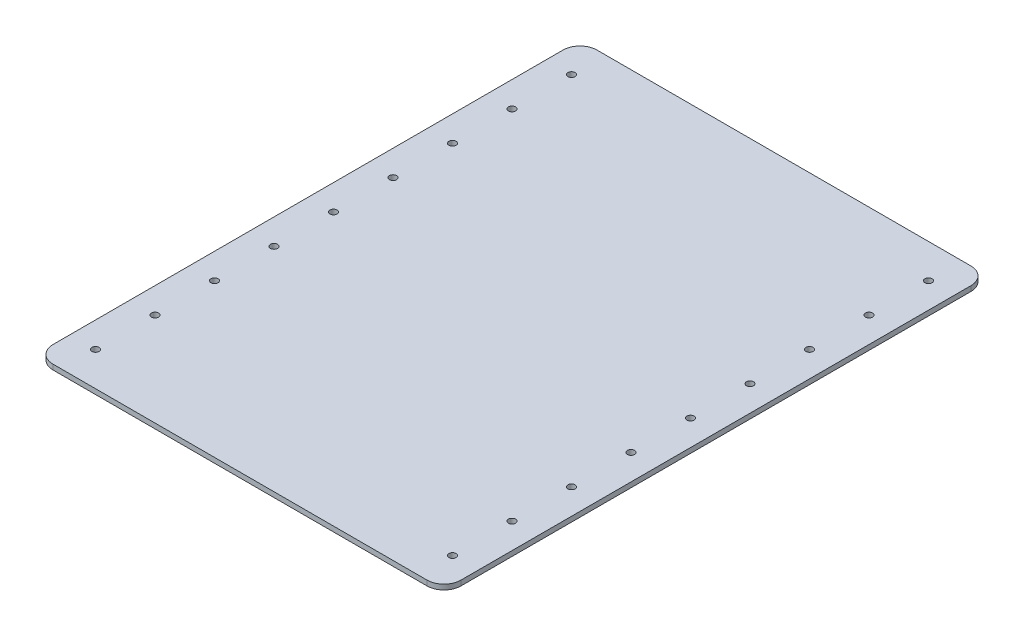
ISO-10303-21;
HEADER;
FILE_DESCRIPTION(('STEP AP214'),'2;1');
FILE_NAME('part.step','',(''),(''),'','','');
FILE_SCHEMA(('AUTOMOTIVE_DESIGN { 1 0 10303 214 1 1 1 1 }'));
ENDSEC;
DATA;
#1=APPLICATION_CONTEXT('core data for automotive mechanical design processes');
#2=APPLICATION_PROTOCOL_DEFINITION('international standard','automotive_design',2000,#1);
#3=PRODUCT_CONTEXT('',#1,'mechanical');
#4=PRODUCT('Part','Part','',(#3));
#5=PRODUCT_RELATED_PRODUCT_CATEGORY('part','',(#4));
#6=PRODUCT_DEFINITION_FORMATION('','',#4);
#7=PRODUCT_DEFINITION_CONTEXT('part definition',#1,'design');
#8=PRODUCT_DEFINITION('design','',#6,#7);
#9=PRODUCT_DEFINITION_SHAPE('','',#8);
#10=(LENGTH_UNIT() NAMED_UNIT(*) SI_UNIT(.MILLI.,.METRE.));
#11=(NAMED_UNIT(*) PLANE_ANGLE_UNIT() SI_UNIT($,.RADIAN.));
#12=(NAMED_UNIT(*) SI_UNIT($,.STERADIAN.) SOLID_ANGLE_UNIT());
#13=UNCERTAINTY_MEASURE_WITH_UNIT(LENGTH_MEASURE(1.E-05),#10,'distance_accuracy_value','');
#14=(GEOMETRIC_REPRESENTATION_CONTEXT(3) GLOBAL_UNCERTAINTY_ASSIGNED_CONTEXT((#13)) GLOBAL_UNIT_ASSIGNED_CONTEXT((#10,
#11,#12)) REPRESENTATION_CONTEXT('',''));
#15=CARTESIAN_POINT('',(0.,0.,0.));
#16=DIRECTION('',(0.,0.,1.));
#17=DIRECTION('',(1.,0.,0.));
#18=AXIS2_PLACEMENT_3D('',#15,#16,#17);
#19=CARTESIAN_POINT('',(120.,3.,-160.));
#20=DIRECTION('',(-1.,0.,0.));
#21=DIRECTION('',(0.,0.,1.));
#22=AXIS2_PLACEMENT_3D('',#19,#20,#21);
#23=PLANE('',#22);
#24=DIRECTION('',(0.,0.,-1.));
#25=VECTOR('',#24,1.);
#26=CARTESIAN_POINT('',(120.,0.,-160.));
#27=LINE('',#26,#25);
#28=CARTESIAN_POINT('',(120.,0.,150.));
#29=VERTEX_POINT('',#28);
#30=CARTESIAN_POINT('',(120.,0.,-150.));
#31=VERTEX_POINT('',#30);
#32=EDGE_CURVE('E130',#29,#31,#27,.T.);
#33=ORIENTED_EDGE('',*,*,#32,.T.);
#34=DIRECTION('',(0.,-1.,0.));
#35=VECTOR('',#34,1.);
#36=CARTESIAN_POINT('',(120.,3.,-150.));
#37=LINE('',#36,#35);
#38=CARTESIAN_POINT('',(120.,3.,-150.));
#39=VERTEX_POINT('',#38);
#40=EDGE_CURVE('E153',#31,#39,#37,.F.);
#41=ORIENTED_EDGE('',*,*,#40,.T.);
#42=DIRECTION('',(0.,0.,-1.));
#43=VECTOR('',#42,1.);
#44=CARTESIAN_POINT('',(120.,3.,-160.));
#45=LINE('',#44,#43);
#46=CARTESIAN_POINT('',(120.,3.,150.));
#47=VERTEX_POINT('',#46);
#48=EDGE_CURVE('E128',#47,#39,#45,.T.);
#49=ORIENTED_EDGE('',*,*,#48,.F.);
#50=DIRECTION('',(0.,-1.,0.));
#51=VECTOR('',#50,1.);
#52=CARTESIAN_POINT('',(120.,3.,150.));
#53=LINE('',#52,#51);
#54=EDGE_CURVE('E150',#47,#29,#53,.T.);
#55=ORIENTED_EDGE('',*,*,#54,.T.);
#56=EDGE_LOOP('',(#33,#41,#49,#55));
#57=FACE_BOUND('',#56,.T.);
#58=ADVANCED_FACE('F35',(#57),#23,.F.);
#59=CARTESIAN_POINT('',(-120.,3.,-160.));
#60=DIRECTION('',(0.,0.,1.));
#61=DIRECTION('',(1.,0.,0.));
#62=AXIS2_PLACEMENT_3D('',#59,#60,#61);
#63=PLANE('',#62);
#64=DIRECTION('',(-1.,0.,0.));
#65=VECTOR('',#64,1.);
#66=CARTESIAN_POINT('',(-120.,0.,-160.));
#67=LINE('',#66,#65);
#68=CARTESIAN_POINT('',(110.,0.,-160.));
#69=VERTEX_POINT('',#68);
#70=CARTESIAN_POINT('',(-110.,0.,-160.));
#71=VERTEX_POINT('',#70);
#72=EDGE_CURVE('E126',#69,#71,#67,.T.);
#73=ORIENTED_EDGE('',*,*,#72,.T.);
#74=DIRECTION('',(0.,-1.,0.));
#75=VECTOR('',#74,1.);
#76=CARTESIAN_POINT('',(-110.,3.,-160.));
#77=LINE('',#76,#75);
#78=CARTESIAN_POINT('',(-110.,3.,-160.));
#79=VERTEX_POINT('',#78);
#80=EDGE_CURVE('E105',#71,#79,#77,.F.);
#81=ORIENTED_EDGE('',*,*,#80,.T.);
#82=DIRECTION('',(-1.,0.,0.));
#83=VECTOR('',#82,1.);
#84=CARTESIAN_POINT('',(-120.,3.,-160.));
#85=LINE('',#84,#83);
#86=CARTESIAN_POINT('',(110.,3.,-160.));
#87=VERTEX_POINT('',#86);
#88=EDGE_CURVE('E169',#87,#79,#85,.T.);
#89=ORIENTED_EDGE('',*,*,#88,.F.);
#90=DIRECTION('',(0.,-1.,0.));
#91=VECTOR('',#90,1.);
#92=CARTESIAN_POINT('',(110.,3.,-160.));
#93=LINE('',#92,#91);
#94=EDGE_CURVE('E110',#87,#69,#93,.T.);
#95=ORIENTED_EDGE('',*,*,#94,.T.);
#96=EDGE_LOOP('',(#73,#81,#89,#95));
#97=FACE_BOUND('',#96,.T.);
#98=ADVANCED_FACE('F305',(#97),#63,.F.);
#99=CARTESIAN_POINT('',(-120.,3.,-160.));
#100=DIRECTION('',(1.,0.,0.));
#101=DIRECTION('',(0.,0.,-1.));
#102=AXIS2_PLACEMENT_3D('',#99,#100,#101);
#103=PLANE('',#102);
#104=DIRECTION('',(0.,0.,1.));
#105=VECTOR('',#104,1.);
#106=CARTESIAN_POINT('',(-120.,3.,-160.));
#107=LINE('',#106,#105);
#108=CARTESIAN_POINT('',(-120.,3.,-150.));
#109=VERTEX_POINT('',#108);
#110=CARTESIAN_POINT('',(-120.,3.,150.));
#111=VERTEX_POINT('',#110);
#112=EDGE_CURVE('E119',#109,#111,#107,.T.);
#113=ORIENTED_EDGE('',*,*,#112,.F.);
#114=DIRECTION('',(0.,-1.,0.));
#115=VECTOR('',#114,1.);
#116=CARTESIAN_POINT('',(-120.,3.,-150.));
#117=LINE('',#116,#115);
#118=CARTESIAN_POINT('',(-120.,0.,-150.));
#119=VERTEX_POINT('',#118);
#120=EDGE_CURVE('E104',#109,#119,#117,.T.);
#121=ORIENTED_EDGE('',*,*,#120,.T.);
#122=DIRECTION('',(0.,0.,1.));
#123=VECTOR('',#122,1.);
#124=CARTESIAN_POINT('',(-120.,0.,-160.));
#125=LINE('',#124,#123);
#126=CARTESIAN_POINT('',(-120.,0.,150.));
#127=VERTEX_POINT('',#126);
#128=EDGE_CURVE('E117',#119,#127,#125,.T.);
#129=ORIENTED_EDGE('',*,*,#128,.T.);
#130=DIRECTION('',(0.,-1.,0.));
#131=VECTOR('',#130,1.);
#132=CARTESIAN_POINT('',(-120.,3.,150.));
#133=LINE('',#132,#131);
#134=EDGE_CURVE('E121',#127,#111,#133,.F.);
#135=ORIENTED_EDGE('',*,*,#134,.T.);
#136=EDGE_LOOP('',(#113,#121,#129,#135));
#137=FACE_BOUND('',#136,.T.);
#138=ADVANCED_FACE('F116',(#137),#103,.F.);
#139=CARTESIAN_POINT('',(-120.,3.,160.));
#140=DIRECTION('',(0.,0.,-1.));
#141=DIRECTION('',(-1.,0.,0.));
#142=AXIS2_PLACEMENT_3D('',#139,#140,#141);
#143=PLANE('',#142);
#144=DIRECTION('',(1.,0.,0.));
#145=VECTOR('',#144,1.);
#146=CARTESIAN_POINT('',(-120.,0.,160.));
#147=LINE('',#146,#145);
#148=CARTESIAN_POINT('',(-110.,0.,160.));
#149=VERTEX_POINT('',#148);
#150=CARTESIAN_POINT('',(110.,0.,160.));
#151=VERTEX_POINT('',#150);
#152=EDGE_CURVE('E125',#149,#151,#147,.T.);
#153=ORIENTED_EDGE('',*,*,#152,.T.);
#154=DIRECTION('',(0.,-1.,0.));
#155=VECTOR('',#154,1.);
#156=CARTESIAN_POINT('',(110.,3.,160.));
#157=LINE('',#156,#155);
#158=CARTESIAN_POINT('',(110.,3.,160.));
#159=VERTEX_POINT('',#158);
#160=EDGE_CURVE('E11',#151,#159,#157,.F.);
#161=ORIENTED_EDGE('',*,*,#160,.T.);
#162=DIRECTION('',(1.,0.,0.));
#163=VECTOR('',#162,1.);
#164=CARTESIAN_POINT('',(-120.,3.,160.));
#165=LINE('',#164,#163);
#166=CARTESIAN_POINT('',(-110.,3.,160.));
#167=VERTEX_POINT('',#166);
#168=EDGE_CURVE('E134',#167,#159,#165,.T.);
#169=ORIENTED_EDGE('',*,*,#168,.F.);
#170=DIRECTION('',(0.,-1.,0.));
#171=VECTOR('',#170,1.);
#172=CARTESIAN_POINT('',(-110.,3.,160.));
#173=LINE('',#172,#171);
#174=EDGE_CURVE('E43',#167,#149,#173,.T.);
#175=ORIENTED_EDGE('',*,*,#174,.T.);
#176=EDGE_LOOP('',(#153,#161,#169,#175));
#177=FACE_BOUND('',#176,.T.);
#178=ADVANCED_FACE('F156',(#177),#143,.F.);
#179=CARTESIAN_POINT('',(0.,3.,0.));
#180=DIRECTION('',(0.,1.,0.));
#181=DIRECTION('',(0.,0.,1.));
#182=AXIS2_PLACEMENT_3D('',#179,#180,#181);
#183=PLANE('',#182);
#184=CARTESIAN_POINT('',(104.999999999999,3.,-140.000000000001));
#185=DIRECTION('',(0.,1.,0.));
#186=DIRECTION('',(0.,0.,-1.));
#187=AXIS2_PLACEMENT_3D('',#184,#185,#186);
#188=CIRCLE('',#187,2.1);
#189=CARTESIAN_POINT('',(104.999999999999,3.,-142.100000000001));
#190=VERTEX_POINT('',#189);
#191=EDGE_CURVE('E185',#190,#190,#188,.T.);
#192=ORIENTED_EDGE('',*,*,#191,.F.);
#193=EDGE_LOOP('',(#192));
#194=FACE_BOUND('',#193,.T.);
#195=CARTESIAN_POINT('',(104.999999999999,3.,-105.000000000001));
#196=DIRECTION('',(0.,1.,0.));
#197=DIRECTION('',(0.,0.,-1.));
#198=AXIS2_PLACEMENT_3D('',#195,#196,#197);
#199=CIRCLE('',#198,2.10000000000003);
#200=CARTESIAN_POINT('',(104.999999999999,3.,-107.100000000001));
#201=VERTEX_POINT('',#200);
#202=EDGE_CURVE('E191',#201,#201,#199,.T.);
#203=ORIENTED_EDGE('',*,*,#202,.F.);
#204=EDGE_LOOP('',(#203));
#205=FACE_BOUND('',#204,.T.);
#206=CARTESIAN_POINT('',(104.999999999999,3.,-70.0000000000007));
#207=DIRECTION('',(0.,1.,0.));
#208=DIRECTION('',(0.,0.,-1.));
#209=AXIS2_PLACEMENT_3D('',#206,#207,#208);
#210=CIRCLE('',#209,2.1);
#211=CARTESIAN_POINT('',(104.999999999999,3.,-72.1000000000007));
#212=VERTEX_POINT('',#211);
#213=EDGE_CURVE('E197',#212,#212,#210,.T.);
#214=ORIENTED_EDGE('',*,*,#213,.F.);
#215=EDGE_LOOP('',(#214));
#216=FACE_BOUND('',#215,.T.);
#217=CARTESIAN_POINT('',(104.999999999999,3.,-35.0000000000007));
#218=DIRECTION('',(0.,1.,0.));
#219=DIRECTION('',(0.,0.,-1.));
#220=AXIS2_PLACEMENT_3D('',#217,#218,#219);
#221=CIRCLE('',#220,2.1);
#222=CARTESIAN_POINT('',(104.999999999999,3.,-37.1000000000007));
#223=VERTEX_POINT('',#222);
#224=EDGE_CURVE('E203',#223,#223,#221,.T.);
#225=ORIENTED_EDGE('',*,*,#224,.F.);
#226=EDGE_LOOP('',(#225));
#227=FACE_BOUND('',#226,.T.);
#228=CARTESIAN_POINT('',(104.999999999999,3.,-7.33211081157048E-13));
#229=DIRECTION('',(0.,1.,0.));
#230=DIRECTION('',(0.,0.,-1.));
#231=AXIS2_PLACEMENT_3D('',#228,#229,#230);
#232=CIRCLE('',#231,2.1);
#233=CARTESIAN_POINT('',(104.999999999999,3.,-2.10000000000073));
#234=VERTEX_POINT('',#233);
#235=EDGE_CURVE('E209',#234,#234,#232,.T.);
#236=ORIENTED_EDGE('',*,*,#235,.F.);
#237=EDGE_LOOP('',(#236));
#238=FACE_BOUND('',#237,.T.);
#239=CARTESIAN_POINT('',(104.999999999998,3.,34.9999999999993));
#240=DIRECTION('',(0.,1.,0.));
#241=DIRECTION('',(0.,0.,-1.));
#242=AXIS2_PLACEMENT_3D('',#239,#240,#241);
#243=CIRCLE('',#242,2.1);
#244=CARTESIAN_POINT('',(104.999999999998,3.,32.8999999999993));
#245=VERTEX_POINT('',#244);
#246=EDGE_CURVE('E215',#245,#245,#243,.T.);
#247=ORIENTED_EDGE('',*,*,#246,.F.);
#248=EDGE_LOOP('',(#247));
#249=FACE_BOUND('',#248,.T.);
#250=CARTESIAN_POINT('',(104.999999999998,3.,69.9999999999993));
#251=DIRECTION('',(0.,1.,0.));
#252=DIRECTION('',(0.,0.,-1.));
#253=AXIS2_PLACEMENT_3D('',#250,#251,#252);
#254=CIRCLE('',#253,2.10000000000003);
#255=CARTESIAN_POINT('',(104.999999999998,3.,67.8999999999993));
#256=VERTEX_POINT('',#255);
#257=EDGE_CURVE('E221',#256,#256,#254,.T.);
#258=ORIENTED_EDGE('',*,*,#257,.F.);
#259=EDGE_LOOP('',(#258));
#260=FACE_BOUND('',#259,.T.);
#261=CARTESIAN_POINT('',(104.999999999998,3.,104.999999999999));
#262=DIRECTION('',(0.,1.,0.));
#263=DIRECTION('',(0.,0.,-1.));
#264=AXIS2_PLACEMENT_3D('',#261,#262,#263);
#265=CIRCLE('',#264,2.1);
#266=CARTESIAN_POINT('',(104.999999999998,3.,102.899999999999));
#267=VERTEX_POINT('',#266);
#268=EDGE_CURVE('E227',#267,#267,#265,.T.);
#269=ORIENTED_EDGE('',*,*,#268,.F.);
#270=EDGE_LOOP('',(#269));
#271=FACE_BOUND('',#270,.T.);
#272=CARTESIAN_POINT('',(104.999999999998,3.,139.999999999999));
#273=DIRECTION('',(0.,1.,0.));
#274=DIRECTION('',(0.,0.,-1.));
#275=AXIS2_PLACEMENT_3D('',#272,#273,#274);
#276=CIRCLE('',#275,2.1);
#277=CARTESIAN_POINT('',(104.999999999998,3.,137.899999999999));
#278=VERTEX_POINT('',#277);
#279=EDGE_CURVE('E233',#278,#278,#276,.T.);
#280=ORIENTED_EDGE('',*,*,#279,.F.);
#281=EDGE_LOOP('',(#280));
#282=FACE_BOUND('',#281,.T.);
#283=CARTESIAN_POINT('',(-104.999999999997,3.,140.));
#284=DIRECTION('',(0.,1.,0.));
#285=DIRECTION('',(0.,0.,1.));
#286=AXIS2_PLACEMENT_3D('',#283,#284,#285);
#287=CIRCLE('',#286,2.1);
#288=CARTESIAN_POINT('',(-104.999999999997,3.,142.1));
#289=VERTEX_POINT('',#288);
#290=EDGE_CURVE('E239',#289,#289,#287,.T.);
#291=ORIENTED_EDGE('',*,*,#290,.F.);
#292=EDGE_LOOP('',(#291));
#293=FACE_BOUND('',#292,.T.);
#294=CARTESIAN_POINT('',(-104.999999999997,3.,105.));
#295=DIRECTION('',(0.,1.,0.));
#296=DIRECTION('',(0.,0.,1.));
#297=AXIS2_PLACEMENT_3D('',#294,#295,#296);
#298=CIRCLE('',#297,2.1);
#299=CARTESIAN_POINT('',(-104.999999999997,3.,107.1));
#300=VERTEX_POINT('',#299);
#301=EDGE_CURVE('E245',#300,#300,#298,.T.);
#302=ORIENTED_EDGE('',*,*,#301,.F.);
#303=EDGE_LOOP('',(#302));
#304=FACE_BOUND('',#303,.T.);
#305=CARTESIAN_POINT('',(-104.999999999998,3.,70.));
#306=DIRECTION('',(0.,1.,0.));
#307=DIRECTION('',(0.,0.,1.));
#308=AXIS2_PLACEMENT_3D('',#305,#306,#307);
#309=CIRCLE('',#308,2.1);
#310=CARTESIAN_POINT('',(-104.999999999998,3.,72.1));
#311=VERTEX_POINT('',#310);
#312=EDGE_CURVE('E251',#311,#311,#309,.T.);
#313=ORIENTED_EDGE('',*,*,#312,.F.);
#314=EDGE_LOOP('',(#313));
#315=FACE_BOUND('',#314,.T.);
#316=CARTESIAN_POINT('',(-104.999999999998,3.,35.));
#317=DIRECTION('',(0.,1.,0.));
#318=DIRECTION('',(0.,0.,1.));
#319=AXIS2_PLACEMENT_3D('',#316,#317,#318);
#320=CIRCLE('',#319,2.1);
#321=CARTESIAN_POINT('',(-104.999999999998,3.,37.1));
#322=VERTEX_POINT('',#321);
#323=EDGE_CURVE('E257',#322,#322,#320,.T.);
#324=ORIENTED_EDGE('',*,*,#323,.F.);
#325=EDGE_LOOP('',(#324));
#326=FACE_BOUND('',#325,.T.);
#327=CARTESIAN_POINT('',(-104.999999999999,3.,0.));
#328=DIRECTION('',(0.,1.,0.));
#329=DIRECTION('',(0.,0.,1.));
#330=AXIS2_PLACEMENT_3D('',#327,#328,#329);
#331=CIRCLE('',#330,2.1);
#332=CARTESIAN_POINT('',(-104.999999999999,3.,2.1));
#333=VERTEX_POINT('',#332);
#334=EDGE_CURVE('E263',#333,#333,#331,.T.);
#335=ORIENTED_EDGE('',*,*,#334,.F.);
#336=EDGE_LOOP('',(#335));
#337=FACE_BOUND('',#336,.T.);
#338=CARTESIAN_POINT('',(-104.999999999999,3.,-35.));
#339=DIRECTION('',(0.,1.,0.));
#340=DIRECTION('',(0.,0.,1.));
#341=AXIS2_PLACEMENT_3D('',#338,#339,#340);
#342=CIRCLE('',#341,2.1);
#343=CARTESIAN_POINT('',(-104.999999999999,3.,-32.9));
#344=VERTEX_POINT('',#343);
#345=EDGE_CURVE('E269',#344,#344,#342,.T.);
#346=ORIENTED_EDGE('',*,*,#345,.F.);
#347=EDGE_LOOP('',(#346));
#348=FACE_BOUND('',#347,.T.);
#349=CARTESIAN_POINT('',(-104.999999999999,3.,-70.));
#350=DIRECTION('',(0.,1.,0.));
#351=DIRECTION('',(0.,0.,1.));
#352=AXIS2_PLACEMENT_3D('',#349,#350,#351);
#353=CIRCLE('',#352,2.1);
#354=CARTESIAN_POINT('',(-104.999999999999,3.,-67.9));
#355=VERTEX_POINT('',#354);
#356=EDGE_CURVE('E275',#355,#355,#353,.T.);
#357=ORIENTED_EDGE('',*,*,#356,.F.);
#358=EDGE_LOOP('',(#357));
#359=FACE_BOUND('',#358,.T.);
#360=CARTESIAN_POINT('',(-105.,3.,-105.));
#361=DIRECTION('',(0.,1.,0.));
#362=DIRECTION('',(0.,0.,1.));
#363=AXIS2_PLACEMENT_3D('',#360,#361,#362);
#364=CIRCLE('',#363,2.1);
#365=CARTESIAN_POINT('',(-105.,3.,-102.9));
#366=VERTEX_POINT('',#365);
#367=EDGE_CURVE('E281',#366,#366,#364,.T.);
#368=ORIENTED_EDGE('',*,*,#367,.F.);
#369=EDGE_LOOP('',(#368));
#370=FACE_BOUND('',#369,.T.);
#371=CARTESIAN_POINT('',(-105.,3.,-140.));
#372=DIRECTION('',(0.,1.,0.));
#373=DIRECTION('',(0.,0.,1.));
#374=AXIS2_PLACEMENT_3D('',#371,#372,#373);
#375=CIRCLE('',#374,2.1);
#376=CARTESIAN_POINT('',(-105.,3.,-137.9));
#377=VERTEX_POINT('',#376);
#378=EDGE_CURVE('E174',#377,#377,#375,.T.);
#379=ORIENTED_EDGE('',*,*,#378,.F.);
#380=EDGE_LOOP('',(#379));
#381=FACE_BOUND('',#380,.T.);
#382=ORIENTED_EDGE('',*,*,#88,.T.);
#383=CARTESIAN_POINT('',(-110.,3.,-150.));
#384=DIRECTION('',(0.,1.,0.));
#385=DIRECTION('',(0.,0.,1.));
#386=AXIS2_PLACEMENT_3D('',#383,#384,#385);
#387=CIRCLE('',#386,10.);
#388=EDGE_CURVE('E148',#79,#109,#387,.T.);
#389=ORIENTED_EDGE('',*,*,#388,.T.);
#390=ORIENTED_EDGE('',*,*,#112,.T.);
#391=CARTESIAN_POINT('',(-110.,3.,150.));
#392=DIRECTION('',(0.,1.,0.));
#393=DIRECTION('',(0.,0.,1.));
#394=AXIS2_PLACEMENT_3D('',#391,#392,#393);
#395=CIRCLE('',#394,10.);
#396=EDGE_CURVE('E55',#111,#167,#395,.T.);
#397=ORIENTED_EDGE('',*,*,#396,.T.);
#398=ORIENTED_EDGE('',*,*,#168,.T.);
#399=CARTESIAN_POINT('',(110.,3.,150.));
#400=DIRECTION('',(0.,1.,0.));
#401=DIRECTION('',(0.,0.,1.));
#402=AXIS2_PLACEMENT_3D('',#399,#400,#401);
#403=CIRCLE('',#402,10.);
#404=EDGE_CURVE('E144',#159,#47,#403,.T.);
#405=ORIENTED_EDGE('',*,*,#404,.T.);
#406=ORIENTED_EDGE('',*,*,#48,.T.);
#407=CARTESIAN_POINT('',(110.,3.,-150.));
#408=DIRECTION('',(0.,1.,0.));
#409=DIRECTION('',(0.,0.,1.));
#410=AXIS2_PLACEMENT_3D('',#407,#408,#409);
#411=CIRCLE('',#410,10.);
#412=EDGE_CURVE('E146',#39,#87,#411,.T.);
#413=ORIENTED_EDGE('',*,*,#412,.T.);
#414=EDGE_LOOP('',(#382,#389,#390,#397,#398,#405,#406,#413));
#415=FACE_BOUND('',#414,.T.);
#416=ADVANCED_FACE('F296',(#194,#205,#216,#227,#238,#249,#260,#271,#282,#293,#304,#315,#326,
#337,#348,#359,#370,#381,#415),#183,.T.);
#417=CARTESIAN_POINT('',(0.,0.,0.));
#418=DIRECTION('',(0.,1.,0.));
#419=DIRECTION('',(0.,0.,1.));
#420=AXIS2_PLACEMENT_3D('',#417,#418,#419);
#421=PLANE('',#420);
#422=CARTESIAN_POINT('',(104.999999999999,0.,-140.000000000001));
#423=DIRECTION('',(0.,1.,0.));
#424=DIRECTION('',(0.,0.,-1.));
#425=AXIS2_PLACEMENT_3D('',#422,#423,#424);
#426=CIRCLE('',#425,2.1);
#427=CARTESIAN_POINT('',(104.999999999999,0.,-142.100000000001));
#428=VERTEX_POINT('',#427);
#429=EDGE_CURVE('E188',#428,#428,#426,.T.);
#430=ORIENTED_EDGE('',*,*,#429,.T.);
#431=EDGE_LOOP('',(#430));
#432=FACE_BOUND('',#431,.T.);
#433=CARTESIAN_POINT('',(104.999999999999,0.,-105.000000000001));
#434=DIRECTION('',(0.,1.,0.));
#435=DIRECTION('',(0.,0.,-1.));
#436=AXIS2_PLACEMENT_3D('',#433,#434,#435);
#437=CIRCLE('',#436,2.10000000000003);
#438=CARTESIAN_POINT('',(104.999999999999,0.,-107.100000000001));
#439=VERTEX_POINT('',#438);
#440=EDGE_CURVE('E194',#439,#439,#437,.T.);
#441=ORIENTED_EDGE('',*,*,#440,.T.);
#442=EDGE_LOOP('',(#441));
#443=FACE_BOUND('',#442,.T.);
#444=CARTESIAN_POINT('',(104.999999999999,0.,-70.0000000000007));
#445=DIRECTION('',(0.,1.,0.));
#446=DIRECTION('',(0.,0.,-1.));
#447=AXIS2_PLACEMENT_3D('',#444,#445,#446);
#448=CIRCLE('',#447,2.1);
#449=CARTESIAN_POINT('',(104.999999999999,0.,-72.1000000000007));
#450=VERTEX_POINT('',#449);
#451=EDGE_CURVE('E200',#450,#450,#448,.T.);
#452=ORIENTED_EDGE('',*,*,#451,.T.);
#453=EDGE_LOOP('',(#452));
#454=FACE_BOUND('',#453,.T.);
#455=CARTESIAN_POINT('',(104.999999999999,0.,-35.0000000000007));
#456=DIRECTION('',(0.,1.,0.));
#457=DIRECTION('',(0.,0.,-1.));
#458=AXIS2_PLACEMENT_3D('',#455,#456,#457);
#459=CIRCLE('',#458,2.1);
#460=CARTESIAN_POINT('',(104.999999999999,0.,-37.1000000000007));
#461=VERTEX_POINT('',#460);
#462=EDGE_CURVE('E206',#461,#461,#459,.T.);
#463=ORIENTED_EDGE('',*,*,#462,.T.);
#464=EDGE_LOOP('',(#463));
#465=FACE_BOUND('',#464,.T.);
#466=CARTESIAN_POINT('',(104.999999999999,0.,-7.33211081157048E-13));
#467=DIRECTION('',(0.,1.,0.));
#468=DIRECTION('',(0.,0.,-1.));
#469=AXIS2_PLACEMENT_3D('',#466,#467,#468);
#470=CIRCLE('',#469,2.1);
#471=CARTESIAN_POINT('',(104.999999999999,0.,-2.10000000000073));
#472=VERTEX_POINT('',#471);
#473=EDGE_CURVE('E212',#472,#472,#470,.T.);
#474=ORIENTED_EDGE('',*,*,#473,.T.);
#475=EDGE_LOOP('',(#474));
#476=FACE_BOUND('',#475,.T.);
#477=CARTESIAN_POINT('',(104.999999999998,0.,34.9999999999993));
#478=DIRECTION('',(0.,1.,0.));
#479=DIRECTION('',(0.,0.,-1.));
#480=AXIS2_PLACEMENT_3D('',#477,#478,#479);
#481=CIRCLE('',#480,2.1);
#482=CARTESIAN_POINT('',(104.999999999998,0.,32.8999999999993));
#483=VERTEX_POINT('',#482);
#484=EDGE_CURVE('E218',#483,#483,#481,.T.);
#485=ORIENTED_EDGE('',*,*,#484,.T.);
#486=EDGE_LOOP('',(#485));
#487=FACE_BOUND('',#486,.T.);
#488=CARTESIAN_POINT('',(104.999999999998,0.,69.9999999999993));
#489=DIRECTION('',(0.,1.,0.));
#490=DIRECTION('',(0.,0.,-1.));
#491=AXIS2_PLACEMENT_3D('',#488,#489,#490);
#492=CIRCLE('',#491,2.10000000000003);
#493=CARTESIAN_POINT('',(104.999999999998,0.,67.8999999999993));
#494=VERTEX_POINT('',#493);
#495=EDGE_CURVE('E224',#494,#494,#492,.T.);
#496=ORIENTED_EDGE('',*,*,#495,.T.);
#497=EDGE_LOOP('',(#496));
#498=FACE_BOUND('',#497,.T.);
#499=CARTESIAN_POINT('',(104.999999999998,0.,104.999999999999));
#500=DIRECTION('',(0.,1.,0.));
#501=DIRECTION('',(0.,0.,-1.));
#502=AXIS2_PLACEMENT_3D('',#499,#500,#501);
#503=CIRCLE('',#502,2.1);
#504=CARTESIAN_POINT('',(104.999999999998,0.,102.899999999999));
#505=VERTEX_POINT('',#504);
#506=EDGE_CURVE('E230',#505,#505,#503,.T.);
#507=ORIENTED_EDGE('',*,*,#506,.T.);
#508=EDGE_LOOP('',(#507));
#509=FACE_BOUND('',#508,.T.);
#510=CARTESIAN_POINT('',(104.999999999998,0.,139.999999999999));
#511=DIRECTION('',(0.,1.,0.));
#512=DIRECTION('',(0.,0.,-1.));
#513=AXIS2_PLACEMENT_3D('',#510,#511,#512);
#514=CIRCLE('',#513,2.1);
#515=CARTESIAN_POINT('',(104.999999999998,0.,137.899999999999));
#516=VERTEX_POINT('',#515);
#517=EDGE_CURVE('E236',#516,#516,#514,.T.);
#518=ORIENTED_EDGE('',*,*,#517,.T.);
#519=EDGE_LOOP('',(#518));
#520=FACE_BOUND('',#519,.T.);
#521=CARTESIAN_POINT('',(-104.999999999997,0.,140.));
#522=DIRECTION('',(0.,1.,0.));
#523=DIRECTION('',(0.,0.,1.));
#524=AXIS2_PLACEMENT_3D('',#521,#522,#523);
#525=CIRCLE('',#524,2.1);
#526=CARTESIAN_POINT('',(-104.999999999997,0.,142.1));
#527=VERTEX_POINT('',#526);
#528=EDGE_CURVE('E242',#527,#527,#525,.T.);
#529=ORIENTED_EDGE('',*,*,#528,.T.);
#530=EDGE_LOOP('',(#529));
#531=FACE_BOUND('',#530,.T.);
#532=CARTESIAN_POINT('',(-104.999999999997,0.,105.));
#533=DIRECTION('',(0.,1.,0.));
#534=DIRECTION('',(0.,0.,1.));
#535=AXIS2_PLACEMENT_3D('',#532,#533,#534);
#536=CIRCLE('',#535,2.1);
#537=CARTESIAN_POINT('',(-104.999999999997,0.,107.1));
#538=VERTEX_POINT('',#537);
#539=EDGE_CURVE('E248',#538,#538,#536,.T.);
#540=ORIENTED_EDGE('',*,*,#539,.T.);
#541=EDGE_LOOP('',(#540));
#542=FACE_BOUND('',#541,.T.);
#543=CARTESIAN_POINT('',(-104.999999999998,0.,70.));
#544=DIRECTION('',(0.,1.,0.));
#545=DIRECTION('',(0.,0.,1.));
#546=AXIS2_PLACEMENT_3D('',#543,#544,#545);
#547=CIRCLE('',#546,2.1);
#548=CARTESIAN_POINT('',(-104.999999999998,0.,72.1));
#549=VERTEX_POINT('',#548);
#550=EDGE_CURVE('E254',#549,#549,#547,.T.);
#551=ORIENTED_EDGE('',*,*,#550,.T.);
#552=EDGE_LOOP('',(#551));
#553=FACE_BOUND('',#552,.T.);
#554=CARTESIAN_POINT('',(-104.999999999998,0.,35.));
#555=DIRECTION('',(0.,1.,0.));
#556=DIRECTION('',(0.,0.,1.));
#557=AXIS2_PLACEMENT_3D('',#554,#555,#556);
#558=CIRCLE('',#557,2.1);
#559=CARTESIAN_POINT('',(-104.999999999998,0.,37.1));
#560=VERTEX_POINT('',#559);
#561=EDGE_CURVE('E260',#560,#560,#558,.T.);
#562=ORIENTED_EDGE('',*,*,#561,.T.);
#563=EDGE_LOOP('',(#562));
#564=FACE_BOUND('',#563,.T.);
#565=CARTESIAN_POINT('',(-104.999999999999,0.,0.));
#566=DIRECTION('',(0.,1.,0.));
#567=DIRECTION('',(0.,0.,1.));
#568=AXIS2_PLACEMENT_3D('',#565,#566,#567);
#569=CIRCLE('',#568,2.1);
#570=CARTESIAN_POINT('',(-104.999999999999,0.,2.1));
#571=VERTEX_POINT('',#570);
#572=EDGE_CURVE('E266',#571,#571,#569,.T.);
#573=ORIENTED_EDGE('',*,*,#572,.T.);
#574=EDGE_LOOP('',(#573));
#575=FACE_BOUND('',#574,.T.);
#576=CARTESIAN_POINT('',(-104.999999999999,0.,-35.));
#577=DIRECTION('',(0.,1.,0.));
#578=DIRECTION('',(0.,0.,1.));
#579=AXIS2_PLACEMENT_3D('',#576,#577,#578);
#580=CIRCLE('',#579,2.1);
#581=CARTESIAN_POINT('',(-104.999999999999,0.,-32.9));
#582=VERTEX_POINT('',#581);
#583=EDGE_CURVE('E272',#582,#582,#580,.T.);
#584=ORIENTED_EDGE('',*,*,#583,.T.);
#585=EDGE_LOOP('',(#584));
#586=FACE_BOUND('',#585,.T.);
#587=CARTESIAN_POINT('',(-104.999999999999,0.,-70.));
#588=DIRECTION('',(0.,1.,0.));
#589=DIRECTION('',(0.,0.,1.));
#590=AXIS2_PLACEMENT_3D('',#587,#588,#589);
#591=CIRCLE('',#590,2.1);
#592=CARTESIAN_POINT('',(-104.999999999999,0.,-67.9));
#593=VERTEX_POINT('',#592);
#594=EDGE_CURVE('E278',#593,#593,#591,.T.);
#595=ORIENTED_EDGE('',*,*,#594,.T.);
#596=EDGE_LOOP('',(#595));
#597=FACE_BOUND('',#596,.T.);
#598=CARTESIAN_POINT('',(-105.,0.,-105.));
#599=DIRECTION('',(0.,1.,0.));
#600=DIRECTION('',(0.,0.,1.));
#601=AXIS2_PLACEMENT_3D('',#598,#599,#600);
#602=CIRCLE('',#601,2.1);
#603=CARTESIAN_POINT('',(-105.,0.,-102.9));
#604=VERTEX_POINT('',#603);
#605=EDGE_CURVE('E183',#604,#604,#602,.T.);
#606=ORIENTED_EDGE('',*,*,#605,.T.);
#607=EDGE_LOOP('',(#606));
#608=FACE_BOUND('',#607,.T.);
#609=CARTESIAN_POINT('',(-105.,0.,-140.));
#610=DIRECTION('',(0.,1.,0.));
#611=DIRECTION('',(0.,0.,1.));
#612=AXIS2_PLACEMENT_3D('',#609,#610,#611);
#613=CIRCLE('',#612,2.1);
#614=CARTESIAN_POINT('',(-105.,0.,-137.9));
#615=VERTEX_POINT('',#614);
#616=EDGE_CURVE('E178',#615,#615,#613,.T.);
#617=ORIENTED_EDGE('',*,*,#616,.T.);
#618=EDGE_LOOP('',(#617));
#619=FACE_BOUND('',#618,.T.);
#620=ORIENTED_EDGE('',*,*,#128,.F.);
#621=CARTESIAN_POINT('',(-110.,0.,-150.));
#622=DIRECTION('',(0.,1.,0.));
#623=DIRECTION('',(0.,0.,1.));
#624=AXIS2_PLACEMENT_3D('',#621,#622,#623);
#625=CIRCLE('',#624,10.);
#626=EDGE_CURVE('E100',#119,#71,#625,.F.);
#627=ORIENTED_EDGE('',*,*,#626,.T.);
#628=ORIENTED_EDGE('',*,*,#72,.F.);
#629=CARTESIAN_POINT('',(110.,0.,-150.));
#630=DIRECTION('',(0.,1.,0.));
#631=DIRECTION('',(0.,0.,1.));
#632=AXIS2_PLACEMENT_3D('',#629,#630,#631);
#633=CIRCLE('',#632,10.);
#634=EDGE_CURVE('E111',#69,#31,#633,.F.);
#635=ORIENTED_EDGE('',*,*,#634,.T.);
#636=ORIENTED_EDGE('',*,*,#32,.F.);
#637=CARTESIAN_POINT('',(110.,0.,150.));
#638=DIRECTION('',(0.,1.,0.));
#639=DIRECTION('',(0.,0.,1.));
#640=AXIS2_PLACEMENT_3D('',#637,#638,#639);
#641=CIRCLE('',#640,10.);
#642=EDGE_CURVE('E137',#29,#151,#641,.F.);
#643=ORIENTED_EDGE('',*,*,#642,.T.);
#644=ORIENTED_EDGE('',*,*,#152,.F.);
#645=CARTESIAN_POINT('',(-110.,0.,150.));
#646=DIRECTION('',(0.,1.,0.));
#647=DIRECTION('',(0.,0.,1.));
#648=AXIS2_PLACEMENT_3D('',#645,#646,#647);
#649=CIRCLE('',#648,10.);
#650=EDGE_CURVE('E120',#149,#127,#649,.F.);
#651=ORIENTED_EDGE('',*,*,#650,.T.);
#652=EDGE_LOOP('',(#620,#627,#628,#635,#636,#643,#644,#651));
#653=FACE_BOUND('',#652,.T.);
#654=ADVANCED_FACE('F123',(#432,#443,#454,#465,#476,#487,#498,#509,#520,#531,#542,#553,#564,
#575,#586,#597,#608,#619,#653),#421,.F.);
#655=CARTESIAN_POINT('',(-110.,3.,-150.));
#656=DIRECTION('',(0.,-1.,0.));
#657=DIRECTION('',(0.,0.,-1.));
#658=AXIS2_PLACEMENT_3D('',#655,#656,#657);
#659=CYLINDRICAL_SURFACE('',#658,10.);
#660=ORIENTED_EDGE('',*,*,#388,.F.);
#661=ORIENTED_EDGE('',*,*,#80,.F.);
#662=ORIENTED_EDGE('',*,*,#626,.F.);
#663=ORIENTED_EDGE('',*,*,#120,.F.);
#664=EDGE_LOOP('',(#660,#661,#662,#663));
#665=FACE_BOUND('',#664,.T.);
#666=ADVANCED_FACE('F103',(#665),#659,.T.);
#667=CARTESIAN_POINT('',(110.,3.,-150.));
#668=DIRECTION('',(0.,-1.,0.));
#669=DIRECTION('',(0.,0.,-1.));
#670=AXIS2_PLACEMENT_3D('',#667,#668,#669);
#671=CYLINDRICAL_SURFACE('',#670,10.);
#672=ORIENTED_EDGE('',*,*,#412,.F.);
#673=ORIENTED_EDGE('',*,*,#40,.F.);
#674=ORIENTED_EDGE('',*,*,#634,.F.);
#675=ORIENTED_EDGE('',*,*,#94,.F.);
#676=EDGE_LOOP('',(#672,#673,#674,#675));
#677=FACE_BOUND('',#676,.T.);
#678=ADVANCED_FACE('F307',(#677),#671,.T.);
#679=CARTESIAN_POINT('',(110.,3.,150.));
#680=DIRECTION('',(0.,-1.,0.));
#681=DIRECTION('',(0.,0.,-1.));
#682=AXIS2_PLACEMENT_3D('',#679,#680,#681);
#683=CYLINDRICAL_SURFACE('',#682,10.);
#684=ORIENTED_EDGE('',*,*,#404,.F.);
#685=ORIENTED_EDGE('',*,*,#160,.F.);
#686=ORIENTED_EDGE('',*,*,#642,.F.);
#687=ORIENTED_EDGE('',*,*,#54,.F.);
#688=EDGE_LOOP('',(#684,#685,#686,#687));
#689=FACE_BOUND('',#688,.T.);
#690=ADVANCED_FACE('F163',(#689),#683,.T.);
#691=CARTESIAN_POINT('',(-110.,3.,150.));
#692=DIRECTION('',(0.,-1.,0.));
#693=DIRECTION('',(0.,0.,-1.));
#694=AXIS2_PLACEMENT_3D('',#691,#692,#693);
#695=CYLINDRICAL_SURFACE('',#694,10.);
#696=ORIENTED_EDGE('',*,*,#396,.F.);
#697=ORIENTED_EDGE('',*,*,#134,.F.);
#698=ORIENTED_EDGE('',*,*,#650,.F.);
#699=ORIENTED_EDGE('',*,*,#174,.F.);
#700=EDGE_LOOP('',(#696,#697,#698,#699));
#701=FACE_BOUND('',#700,.T.);
#702=ADVANCED_FACE('F37',(#701),#695,.T.);
#703=CARTESIAN_POINT('',(-105.,0.,-140.));
#704=DIRECTION('',(0.,1.,0.));
#705=DIRECTION('',(0.,0.,1.));
#706=AXIS2_PLACEMENT_3D('',#703,#704,#705);
#707=CYLINDRICAL_SURFACE('',#706,2.1);
#708=ORIENTED_EDGE('',*,*,#616,.F.);
#709=EDGE_LOOP('',(#708));
#710=FACE_BOUND('',#709,.T.);
#711=ORIENTED_EDGE('',*,*,#378,.T.);
#712=EDGE_LOOP('',(#711));
#713=FACE_BOUND('',#712,.T.);
#714=ADVANCED_FACE('F292',(#710,#713),#707,.F.);
#715=CARTESIAN_POINT('',(-105.,0.,-105.));
#716=DIRECTION('',(0.,1.,0.));
#717=DIRECTION('',(0.,0.,1.));
#718=AXIS2_PLACEMENT_3D('',#715,#716,#717);
#719=CYLINDRICAL_SURFACE('',#718,2.1);
#720=ORIENTED_EDGE('',*,*,#605,.F.);
#721=EDGE_LOOP('',(#720));
#722=FACE_BOUND('',#721,.T.);
#723=ORIENTED_EDGE('',*,*,#367,.T.);
#724=EDGE_LOOP('',(#723));
#725=FACE_BOUND('',#724,.T.);
#726=ADVANCED_FACE('F288',(#722,#725),#719,.F.);
#727=CARTESIAN_POINT('',(-104.999999999999,0.,-70.));
#728=DIRECTION('',(0.,1.,0.));
#729=DIRECTION('',(0.,0.,1.));
#730=AXIS2_PLACEMENT_3D('',#727,#728,#729);
#731=CYLINDRICAL_SURFACE('',#730,2.1);
#732=ORIENTED_EDGE('',*,*,#594,.F.);
#733=EDGE_LOOP('',(#732));
#734=FACE_BOUND('',#733,.T.);
#735=ORIENTED_EDGE('',*,*,#356,.T.);
#736=EDGE_LOOP('',(#735));
#737=FACE_BOUND('',#736,.T.);
#738=ADVANCED_FACE('F291',(#734,#737),#731,.F.);
#739=CARTESIAN_POINT('',(-104.999999999999,0.,-35.));
#740=DIRECTION('',(0.,1.,0.));
#741=DIRECTION('',(0.,0.,1.));
#742=AXIS2_PLACEMENT_3D('',#739,#740,#741);
#743=CYLINDRICAL_SURFACE('',#742,2.1);
#744=ORIENTED_EDGE('',*,*,#583,.F.);
#745=EDGE_LOOP('',(#744));
#746=FACE_BOUND('',#745,.T.);
#747=ORIENTED_EDGE('',*,*,#345,.T.);
#748=EDGE_LOOP('',(#747));
#749=FACE_BOUND('',#748,.T.);
#750=ADVANCED_FACE('F387',(#746,#749),#743,.F.);
#751=CARTESIAN_POINT('',(-104.999999999999,0.,0.));
#752=DIRECTION('',(0.,1.,0.));
#753=DIRECTION('',(0.,0.,1.));
#754=AXIS2_PLACEMENT_3D('',#751,#752,#753);
#755=CYLINDRICAL_SURFACE('',#754,2.1);
#756=ORIENTED_EDGE('',*,*,#572,.F.);
#757=EDGE_LOOP('',(#756));
#758=FACE_BOUND('',#757,.T.);
#759=ORIENTED_EDGE('',*,*,#334,.T.);
#760=EDGE_LOOP('',(#759));
#761=FACE_BOUND('',#760,.T.);
#762=ADVANCED_FACE('F383',(#758,#761),#755,.F.);
#763=CARTESIAN_POINT('',(-104.999999999998,0.,35.));
#764=DIRECTION('',(0.,1.,0.));
#765=DIRECTION('',(0.,0.,1.));
#766=AXIS2_PLACEMENT_3D('',#763,#764,#765);
#767=CYLINDRICAL_SURFACE('',#766,2.1);
#768=ORIENTED_EDGE('',*,*,#561,.F.);
#769=EDGE_LOOP('',(#768));
#770=FACE_BOUND('',#769,.T.);
#771=ORIENTED_EDGE('',*,*,#323,.T.);
#772=EDGE_LOOP('',(#771));
#773=FACE_BOUND('',#772,.T.);
#774=ADVANCED_FACE('F379',(#770,#773),#767,.F.);
#775=CARTESIAN_POINT('',(-104.999999999998,0.,70.));
#776=DIRECTION('',(0.,1.,0.));
#777=DIRECTION('',(0.,0.,1.));
#778=AXIS2_PLACEMENT_3D('',#775,#776,#777);
#779=CYLINDRICAL_SURFACE('',#778,2.1);
#780=ORIENTED_EDGE('',*,*,#550,.F.);
#781=EDGE_LOOP('',(#780));
#782=FACE_BOUND('',#781,.T.);
#783=ORIENTED_EDGE('',*,*,#312,.T.);
#784=EDGE_LOOP('',(#783));
#785=FACE_BOUND('',#784,.T.);
#786=ADVANCED_FACE('F375',(#782,#785),#779,.F.);
#787=CARTESIAN_POINT('',(-104.999999999997,0.,105.));
#788=DIRECTION('',(0.,1.,0.));
#789=DIRECTION('',(0.,0.,1.));
#790=AXIS2_PLACEMENT_3D('',#787,#788,#789);
#791=CYLINDRICAL_SURFACE('',#790,2.1);
#792=ORIENTED_EDGE('',*,*,#539,.F.);
#793=EDGE_LOOP('',(#792));
#794=FACE_BOUND('',#793,.T.);
#795=ORIENTED_EDGE('',*,*,#301,.T.);
#796=EDGE_LOOP('',(#795));
#797=FACE_BOUND('',#796,.T.);
#798=ADVANCED_FACE('F371',(#794,#797),#791,.F.);
#799=CARTESIAN_POINT('',(-104.999999999997,0.,140.));
#800=DIRECTION('',(0.,1.,0.));
#801=DIRECTION('',(0.,0.,1.));
#802=AXIS2_PLACEMENT_3D('',#799,#800,#801);
#803=CYLINDRICAL_SURFACE('',#802,2.1);
#804=ORIENTED_EDGE('',*,*,#528,.F.);
#805=EDGE_LOOP('',(#804));
#806=FACE_BOUND('',#805,.T.);
#807=ORIENTED_EDGE('',*,*,#290,.T.);
#808=EDGE_LOOP('',(#807));
#809=FACE_BOUND('',#808,.T.);
#810=ADVANCED_FACE('F367',(#806,#809),#803,.F.);
#811=CARTESIAN_POINT('',(104.999999999998,0.,139.999999999999));
#812=DIRECTION('',(0.,1.,0.));
#813=DIRECTION('',(0.,0.,1.));
#814=AXIS2_PLACEMENT_3D('',#811,#812,#813);
#815=CYLINDRICAL_SURFACE('',#814,2.1);
#816=ORIENTED_EDGE('',*,*,#517,.F.);
#817=EDGE_LOOP('',(#816));
#818=FACE_BOUND('',#817,.T.);
#819=ORIENTED_EDGE('',*,*,#279,.T.);
#820=EDGE_LOOP('',(#819));
#821=FACE_BOUND('',#820,.T.);
#822=ADVANCED_FACE('F363',(#818,#821),#815,.F.);
#823=CARTESIAN_POINT('',(104.999999999998,0.,104.999999999999));
#824=DIRECTION('',(0.,1.,0.));
#825=DIRECTION('',(0.,0.,1.));
#826=AXIS2_PLACEMENT_3D('',#823,#824,#825);
#827=CYLINDRICAL_SURFACE('',#826,2.1);
#828=ORIENTED_EDGE('',*,*,#506,.F.);
#829=EDGE_LOOP('',(#828));
#830=FACE_BOUND('',#829,.T.);
#831=ORIENTED_EDGE('',*,*,#268,.T.);
#832=EDGE_LOOP('',(#831));
#833=FACE_BOUND('',#832,.T.);
#834=ADVANCED_FACE('F359',(#830,#833),#827,.F.);
#835=CARTESIAN_POINT('',(104.999999999998,0.,69.9999999999993));
#836=DIRECTION('',(0.,1.,0.));
#837=DIRECTION('',(0.,0.,1.));
#838=AXIS2_PLACEMENT_3D('',#835,#836,#837);
#839=CYLINDRICAL_SURFACE('',#838,2.10000000000003);
#840=ORIENTED_EDGE('',*,*,#495,.F.);
#841=EDGE_LOOP('',(#840));
#842=FACE_BOUND('',#841,.T.);
#843=ORIENTED_EDGE('',*,*,#257,.T.);
#844=EDGE_LOOP('',(#843));
#845=FACE_BOUND('',#844,.T.);
#846=ADVANCED_FACE('F355',(#842,#845),#839,.F.);
#847=CARTESIAN_POINT('',(104.999999999998,0.,34.9999999999993));
#848=DIRECTION('',(0.,1.,0.));
#849=DIRECTION('',(0.,0.,1.));
#850=AXIS2_PLACEMENT_3D('',#847,#848,#849);
#851=CYLINDRICAL_SURFACE('',#850,2.1);
#852=ORIENTED_EDGE('',*,*,#484,.F.);
#853=EDGE_LOOP('',(#852));
#854=FACE_BOUND('',#853,.T.);
#855=ORIENTED_EDGE('',*,*,#246,.T.);
#856=EDGE_LOOP('',(#855));
#857=FACE_BOUND('',#856,.T.);
#858=ADVANCED_FACE('F351',(#854,#857),#851,.F.);
#859=CARTESIAN_POINT('',(104.999999999999,0.,-7.33211081157048E-13));
#860=DIRECTION('',(0.,1.,0.));
#861=DIRECTION('',(0.,0.,1.));
#862=AXIS2_PLACEMENT_3D('',#859,#860,#861);
#863=CYLINDRICAL_SURFACE('',#862,2.1);
#864=ORIENTED_EDGE('',*,*,#473,.F.);
#865=EDGE_LOOP('',(#864));
#866=FACE_BOUND('',#865,.T.);
#867=ORIENTED_EDGE('',*,*,#235,.T.);
#868=EDGE_LOOP('',(#867));
#869=FACE_BOUND('',#868,.T.);
#870=ADVANCED_FACE('F347',(#866,#869),#863,.F.);
#871=CARTESIAN_POINT('',(104.999999999999,0.,-35.0000000000007));
#872=DIRECTION('',(0.,1.,0.));
#873=DIRECTION('',(0.,0.,1.));
#874=AXIS2_PLACEMENT_3D('',#871,#872,#873);
#875=CYLINDRICAL_SURFACE('',#874,2.1);
#876=ORIENTED_EDGE('',*,*,#462,.F.);
#877=EDGE_LOOP('',(#876));
#878=FACE_BOUND('',#877,.T.);
#879=ORIENTED_EDGE('',*,*,#224,.T.);
#880=EDGE_LOOP('',(#879));
#881=FACE_BOUND('',#880,.T.);
#882=ADVANCED_FACE('F343',(#878,#881),#875,.F.);
#883=CARTESIAN_POINT('',(104.999999999999,0.,-70.0000000000007));
#884=DIRECTION('',(0.,1.,0.));
#885=DIRECTION('',(0.,0.,1.));
#886=AXIS2_PLACEMENT_3D('',#883,#884,#885);
#887=CYLINDRICAL_SURFACE('',#886,2.1);
#888=ORIENTED_EDGE('',*,*,#451,.F.);
#889=EDGE_LOOP('',(#888));
#890=FACE_BOUND('',#889,.T.);
#891=ORIENTED_EDGE('',*,*,#213,.T.);
#892=EDGE_LOOP('',(#891));
#893=FACE_BOUND('',#892,.T.);
#894=ADVANCED_FACE('F339',(#890,#893),#887,.F.);
#895=CARTESIAN_POINT('',(104.999999999999,0.,-105.000000000001));
#896=DIRECTION('',(0.,1.,0.));
#897=DIRECTION('',(0.,0.,1.));
#898=AXIS2_PLACEMENT_3D('',#895,#896,#897);
#899=CYLINDRICAL_SURFACE('',#898,2.10000000000003);
#900=ORIENTED_EDGE('',*,*,#440,.F.);
#901=EDGE_LOOP('',(#900));
#902=FACE_BOUND('',#901,.T.);
#903=ORIENTED_EDGE('',*,*,#202,.T.);
#904=EDGE_LOOP('',(#903));
#905=FACE_BOUND('',#904,.T.);
#906=ADVANCED_FACE('F335',(#902,#905),#899,.F.);
#907=CARTESIAN_POINT('',(104.999999999999,0.,-140.000000000001));
#908=DIRECTION('',(0.,1.,0.));
#909=DIRECTION('',(0.,0.,1.));
#910=AXIS2_PLACEMENT_3D('',#907,#908,#909);
#911=CYLINDRICAL_SURFACE('',#910,2.1);
#912=ORIENTED_EDGE('',*,*,#429,.F.);
#913=EDGE_LOOP('',(#912));
#914=FACE_BOUND('',#913,.T.);
#915=ORIENTED_EDGE('',*,*,#191,.T.);
#916=EDGE_LOOP('',(#915));
#917=FACE_BOUND('',#916,.T.);
#918=ADVANCED_FACE('F332',(#914,#917),#911,.F.);
#919=CLOSED_SHELL('',(#58,#98,#138,#178,#416,#654,#666,#678,#690,#702,#714,#726,#738,#750,#762,
#774,#786,#798,#810,#822,#834,#846,#858,#870,#882,#894,#906,#918));
#920=MANIFOLD_SOLID_BREP('B2',#919);
#921=ADVANCED_BREP_SHAPE_REPRESENTATION('',(#18,#920),#14);
#922=SHAPE_DEFINITION_REPRESENTATION(#9,#921);
ENDSEC;
END-ISO-10303-21;
